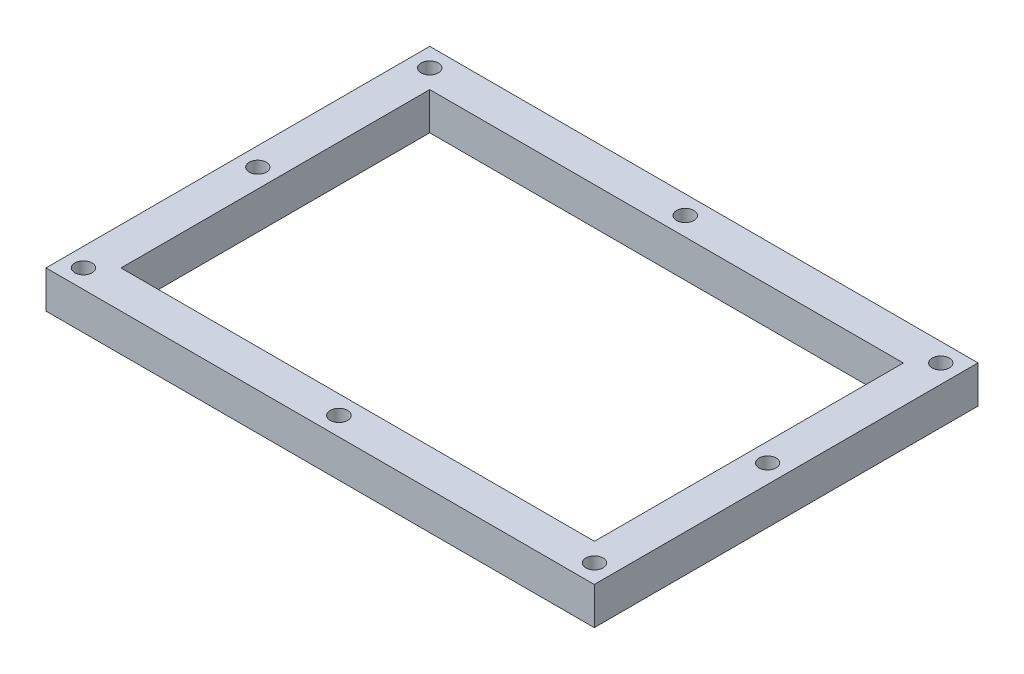
ISO-10303-21;
HEADER;
FILE_DESCRIPTION(('STEP AP214'),'2;1');
FILE_NAME('part.step','',(''),(''),'','','');
FILE_SCHEMA(('AUTOMOTIVE_DESIGN { 1 0 10303 214 1 1 1 1 }'));
ENDSEC;
DATA;
#1=APPLICATION_CONTEXT('core data for automotive mechanical design processes');
#2=APPLICATION_PROTOCOL_DEFINITION('international standard','automotive_design',2000,#1);
#3=PRODUCT_CONTEXT('',#1,'mechanical');
#4=PRODUCT('Part','Part','',(#3));
#5=PRODUCT_RELATED_PRODUCT_CATEGORY('part','',(#4));
#6=PRODUCT_DEFINITION_FORMATION('','',#4);
#7=PRODUCT_DEFINITION_CONTEXT('part definition',#1,'design');
#8=PRODUCT_DEFINITION('design','',#6,#7);
#9=PRODUCT_DEFINITION_SHAPE('','',#8);
#10=(LENGTH_UNIT() NAMED_UNIT(*) SI_UNIT(.MILLI.,.METRE.));
#11=(NAMED_UNIT(*) PLANE_ANGLE_UNIT() SI_UNIT($,.RADIAN.));
#12=(NAMED_UNIT(*) SI_UNIT($,.STERADIAN.) SOLID_ANGLE_UNIT());
#13=UNCERTAINTY_MEASURE_WITH_UNIT(LENGTH_MEASURE(1.E-05),#10,'distance_accuracy_value','');
#14=(GEOMETRIC_REPRESENTATION_CONTEXT(3) GLOBAL_UNCERTAINTY_ASSIGNED_CONTEXT((#13)) GLOBAL_UNIT_ASSIGNED_CONTEXT((#10,
#11,#12)) REPRESENTATION_CONTEXT('',''));
#15=CARTESIAN_POINT('',(0.,0.,0.));
#16=DIRECTION('',(0.,0.,1.));
#17=DIRECTION('',(1.,0.,0.));
#18=AXIS2_PLACEMENT_3D('',#15,#16,#17);
#19=CARTESIAN_POINT('',(-1.72565632312082E-12,246.195974268059,0.));
#20=DIRECTION('',(0.,1.,0.));
#21=DIRECTION('',(-1.,0.,0.));
#22=AXIS2_PLACEMENT_3D('',#19,#20,#21);
#23=PLANE('',#22);
#24=CARTESIAN_POINT('',(133.058980693896,246.19597426806,135.773129836377));
#25=DIRECTION('',(0.,1.,0.));
#26=DIRECTION('',(-1.,0.,0.));
#27=AXIS2_PLACEMENT_3D('',#24,#25,#26);
#28=CIRCLE('',#27,2.30000000000001);
#29=CARTESIAN_POINT('',(130.758980693896,246.19597426806,135.773129836377));
#30=VERTEX_POINT('',#29);
#31=EDGE_CURVE('E293',#30,#30,#28,.T.);
#32=ORIENTED_EDGE('',*,*,#31,.F.);
#33=EDGE_LOOP('',(#32));
#34=FACE_BOUND('',#33,.T.);
#35=CARTESIAN_POINT('',(-3.44101930610673,246.195974268059,43.2731298363772));
#36=DIRECTION('',(0.,1.,0.));
#37=DIRECTION('',(-1.,0.,0.));
#38=AXIS2_PLACEMENT_3D('',#35,#36,#37);
#39=CIRCLE('',#38,2.3);
#40=CARTESIAN_POINT('',(-5.74101930610673,246.195974268059,43.2731298363772));
#41=VERTEX_POINT('',#40);
#42=EDGE_CURVE('E127',#41,#41,#39,.T.);
#43=ORIENTED_EDGE('',*,*,#42,.F.);
#44=EDGE_LOOP('',(#43));
#45=FACE_BOUND('',#44,.T.);
#46=CARTESIAN_POINT('',(64.8089806938964,246.195974268059,135.773129836377));
#47=DIRECTION('',(0.,1.,0.));
#48=DIRECTION('',(-1.,0.,0.));
#49=AXIS2_PLACEMENT_3D('',#46,#47,#48);
#50=CIRCLE('',#49,2.32929018177819);
#51=CARTESIAN_POINT('',(62.4796905121182,246.195974268059,135.773129836377));
#52=VERTEX_POINT('',#51);
#53=EDGE_CURVE('E143',#52,#52,#50,.T.);
#54=ORIENTED_EDGE('',*,*,#53,.F.);
#55=EDGE_LOOP('',(#54));
#56=FACE_BOUND('',#55,.T.);
#57=CARTESIAN_POINT('',(64.8089806938931,246.195974268059,43.2731298363772));
#58=DIRECTION('',(0.,1.,0.));
#59=DIRECTION('',(-1.,0.,0.));
#60=AXIS2_PLACEMENT_3D('',#57,#58,#59);
#61=CIRCLE('',#60,2.32929018177819);
#62=CARTESIAN_POINT('',(62.4796905121149,246.195974268059,43.2731298363772));
#63=VERTEX_POINT('',#62);
#64=EDGE_CURVE('E155',#63,#63,#61,.T.);
#65=ORIENTED_EDGE('',*,*,#64,.F.);
#66=EDGE_LOOP('',(#65));
#67=FACE_BOUND('',#66,.T.);
#68=DIRECTION('',(1.,0.,0.));
#69=VECTOR('',#68,1.);
#70=CARTESIAN_POINT('',(138.010541363209,246.19597426806,140.773129836377));
#71=LINE('',#70,#69);
#72=CARTESIAN_POINT('',(-8.44101930610687,246.195974268059,140.773129836377));
#73=VERTEX_POINT('',#72);
#74=CARTESIAN_POINT('',(138.010541363209,246.19597426806,140.773129836377));
#75=VERTEX_POINT('',#74);
#76=EDGE_CURVE('E161',#73,#75,#71,.T.);
#77=ORIENTED_EDGE('',*,*,#76,.T.);
#78=DIRECTION('',(0.,0.,-1.));
#79=VECTOR('',#78,1.);
#80=CARTESIAN_POINT('',(138.010541363209,246.19597426806,140.773129836377));
#81=LINE('',#80,#79);
#82=CARTESIAN_POINT('',(138.010541363209,246.19597426806,38.2731298363773));
#83=VERTEX_POINT('',#82);
#84=EDGE_CURVE('E164',#75,#83,#81,.T.);
#85=ORIENTED_EDGE('',*,*,#84,.T.);
#86=DIRECTION('',(-1.,0.,0.));
#87=VECTOR('',#86,1.);
#88=CARTESIAN_POINT('',(138.010541363209,246.19597426806,38.2731298363773));
#89=LINE('',#88,#87);
#90=CARTESIAN_POINT('',(-8.44101930610687,246.195974268059,38.2731298363773));
#91=VERTEX_POINT('',#90);
#92=EDGE_CURVE('E167',#83,#91,#89,.T.);
#93=ORIENTED_EDGE('',*,*,#92,.T.);
#94=DIRECTION('',(0.,0.,1.));
#95=VECTOR('',#94,1.);
#96=CARTESIAN_POINT('',(-8.44101930610687,246.195974268059,38.2731298363773));
#97=LINE('',#96,#95);
#98=EDGE_CURVE('E169',#91,#73,#97,.T.);
#99=ORIENTED_EDGE('',*,*,#98,.T.);
#100=EDGE_LOOP('',(#77,#85,#93,#99));
#101=FACE_BOUND('',#100,.T.);
#102=CARTESIAN_POINT('',(-3.44101930610673,246.195974268059,89.1878173326564));
#103=DIRECTION('',(0.,1.,0.));
#104=DIRECTION('',(-1.,0.,0.));
#105=AXIS2_PLACEMENT_3D('',#102,#103,#104);
#106=CIRCLE('',#105,2.29999999999999);
#107=CARTESIAN_POINT('',(-5.74101930610672,246.195974268059,89.1878173326564));
#108=VERTEX_POINT('',#107);
#109=EDGE_CURVE('E149',#108,#108,#106,.T.);
#110=ORIENTED_EDGE('',*,*,#109,.F.);
#111=EDGE_LOOP('',(#110));
#112=FACE_BOUND('',#111,.T.);
#113=CARTESIAN_POINT('',(133.058980693896,246.19597426806,89.5231298363773));
#114=DIRECTION('',(0.,1.,0.));
#115=DIRECTION('',(-1.,0.,0.));
#116=AXIS2_PLACEMENT_3D('',#113,#114,#115);
#117=CIRCLE('',#116,2.30000000000001);
#118=CARTESIAN_POINT('',(130.758980693896,246.19597426806,89.5231298363773));
#119=VERTEX_POINT('',#118);
#120=EDGE_CURVE('E137',#119,#119,#117,.T.);
#121=ORIENTED_EDGE('',*,*,#120,.F.);
#122=EDGE_LOOP('',(#121));
#123=FACE_BOUND('',#122,.T.);
#124=DIRECTION('',(0.,0.,-1.));
#125=VECTOR('',#124,1.);
#126=CARTESIAN_POINT('',(128.058980693893,246.19597426806,48.2731298363773));
#127=LINE('',#126,#125);
#128=CARTESIAN_POINT('',(128.058980693893,246.19597426806,130.773129836377));
#129=VERTEX_POINT('',#128);
#130=CARTESIAN_POINT('',(128.058980693893,246.19597426806,48.2731298363773));
#131=VERTEX_POINT('',#130);
#132=EDGE_CURVE('E106',#129,#131,#127,.T.);
#133=ORIENTED_EDGE('',*,*,#132,.F.);
#134=DIRECTION('',(1.,0.,0.));
#135=VECTOR('',#134,1.);
#136=CARTESIAN_POINT('',(128.058980693893,246.19597426806,130.773129836377));
#137=LINE('',#136,#135);
#138=CARTESIAN_POINT('',(1.5919620459109,246.195974268059,130.773129836377));
#139=VERTEX_POINT('',#138);
#140=EDGE_CURVE('E98',#139,#129,#137,.T.);
#141=ORIENTED_EDGE('',*,*,#140,.F.);
#142=DIRECTION('',(0.000399773931906245,0.,0.999999920090399));
#143=VECTOR('',#142,1.);
#144=CARTESIAN_POINT('',(1.5919620459109,246.195974268059,130.773129836377));
#145=LINE('',#144,#143);
#146=CARTESIAN_POINT('',(1.55898069389311,246.195974268059,48.2731298363773));
#147=VERTEX_POINT('',#146);
#148=EDGE_CURVE('E121',#147,#139,#145,.T.);
#149=ORIENTED_EDGE('',*,*,#148,.F.);
#150=DIRECTION('',(-1.,0.,0.));
#151=VECTOR('',#150,1.);
#152=CARTESIAN_POINT('',(1.55898069389311,246.195974268059,48.2731298363773));
#153=LINE('',#152,#151);
#154=EDGE_CURVE('E119',#131,#147,#153,.T.);
#155=ORIENTED_EDGE('',*,*,#154,.F.);
#156=EDGE_LOOP('',(#133,#141,#149,#155));
#157=FACE_BOUND('',#156,.T.);
#158=CARTESIAN_POINT('',(133.058980693896,246.19597426806,43.2731298363772));
#159=DIRECTION('',(0.,1.,0.));
#160=DIRECTION('',(-1.,0.,0.));
#161=AXIS2_PLACEMENT_3D('',#158,#159,#160);
#162=CIRCLE('',#161,2.30000000000001);
#163=CARTESIAN_POINT('',(130.758980693896,246.19597426806,43.2731298363772));
#164=VERTEX_POINT('',#163);
#165=EDGE_CURVE('E299',#164,#164,#162,.T.);
#166=ORIENTED_EDGE('',*,*,#165,.F.);
#167=EDGE_LOOP('',(#166));
#168=FACE_BOUND('',#167,.T.);
#169=CARTESIAN_POINT('',(-3.44101930610673,246.195974268059,135.773129836377));
#170=DIRECTION('',(0.,1.,0.));
#171=DIRECTION('',(-1.,0.,0.));
#172=AXIS2_PLACEMENT_3D('',#169,#170,#171);
#173=CIRCLE('',#172,2.3);
#174=CARTESIAN_POINT('',(-5.74101930610673,246.195974268059,135.773129836377));
#175=VERTEX_POINT('',#174);
#176=EDGE_CURVE('E284',#175,#175,#173,.T.);
#177=ORIENTED_EDGE('',*,*,#176,.F.);
#178=EDGE_LOOP('',(#177));
#179=FACE_BOUND('',#178,.T.);
#180=ADVANCED_FACE('F33',(#34,#45,#56,#67,#101,#112,#123,#157,#168,#179),#23,.T.);
#181=CARTESIAN_POINT('',(-1.65626738408175E-12,236.195974268059,0.));
#182=DIRECTION('',(0.,1.,0.));
#183=DIRECTION('',(-1.,0.,0.));
#184=AXIS2_PLACEMENT_3D('',#181,#182,#183);
#185=PLANE('',#184);
#186=CARTESIAN_POINT('',(133.058980693896,236.19597426806,89.5231298363773));
#187=DIRECTION('',(0.,1.,0.));
#188=DIRECTION('',(-1.,0.,0.));
#189=AXIS2_PLACEMENT_3D('',#186,#187,#188);
#190=CIRCLE('',#189,2.30000000000001);
#191=CARTESIAN_POINT('',(130.758980693896,236.19597426806,89.5231298363773));
#192=VERTEX_POINT('',#191);
#193=EDGE_CURVE('E114',#192,#192,#190,.T.);
#194=ORIENTED_EDGE('',*,*,#193,.T.);
#195=EDGE_LOOP('',(#194));
#196=FACE_BOUND('',#195,.T.);
#197=CARTESIAN_POINT('',(64.8089806938964,236.195974268059,135.773129836377));
#198=DIRECTION('',(0.,1.,0.));
#199=DIRECTION('',(-1.,0.,0.));
#200=AXIS2_PLACEMENT_3D('',#197,#198,#199);
#201=CIRCLE('',#200,2.32929018177819);
#202=CARTESIAN_POINT('',(62.4796905121182,236.195974268059,135.773129836377));
#203=VERTEX_POINT('',#202);
#204=EDGE_CURVE('E140',#203,#203,#201,.T.);
#205=ORIENTED_EDGE('',*,*,#204,.T.);
#206=EDGE_LOOP('',(#205));
#207=FACE_BOUND('',#206,.T.);
#208=CARTESIAN_POINT('',(-3.44101930610666,236.195974268059,89.1878173326564));
#209=DIRECTION('',(0.,1.,0.));
#210=DIRECTION('',(-1.,0.,0.));
#211=AXIS2_PLACEMENT_3D('',#208,#209,#210);
#212=CIRCLE('',#211,2.29999999999999);
#213=CARTESIAN_POINT('',(-5.74101930610665,236.195974268059,89.1878173326564));
#214=VERTEX_POINT('',#213);
#215=EDGE_CURVE('E146',#214,#214,#212,.T.);
#216=ORIENTED_EDGE('',*,*,#215,.T.);
#217=EDGE_LOOP('',(#216));
#218=FACE_BOUND('',#217,.T.);
#219=CARTESIAN_POINT('',(64.8089806938932,236.195974268059,43.2731298363772));
#220=DIRECTION('',(0.,1.,0.));
#221=DIRECTION('',(-1.,0.,0.));
#222=AXIS2_PLACEMENT_3D('',#219,#220,#221);
#223=CIRCLE('',#222,2.32929018177819);
#224=CARTESIAN_POINT('',(62.479690512115,236.195974268059,43.2731298363772));
#225=VERTEX_POINT('',#224);
#226=EDGE_CURVE('E152',#225,#225,#223,.T.);
#227=ORIENTED_EDGE('',*,*,#226,.T.);
#228=EDGE_LOOP('',(#227));
#229=FACE_BOUND('',#228,.T.);
#230=DIRECTION('',(1.,0.,0.));
#231=VECTOR('',#230,1.);
#232=CARTESIAN_POINT('',(138.010541363209,236.19597426806,140.773129836377));
#233=LINE('',#232,#231);
#234=CARTESIAN_POINT('',(-8.4410193061068,236.195974268059,140.773129836377));
#235=VERTEX_POINT('',#234);
#236=CARTESIAN_POINT('',(138.010541363209,236.19597426806,140.773129836377));
#237=VERTEX_POINT('',#236);
#238=EDGE_CURVE('E158',#235,#237,#233,.T.);
#239=ORIENTED_EDGE('',*,*,#238,.F.);
#240=DIRECTION('',(0.,0.,1.));
#241=VECTOR('',#240,1.);
#242=CARTESIAN_POINT('',(-8.4410193061068,236.195974268059,38.2731298363773));
#243=LINE('',#242,#241);
#244=CARTESIAN_POINT('',(-8.4410193061068,236.195974268059,38.2731298363773));
#245=VERTEX_POINT('',#244);
#246=EDGE_CURVE('E165',#245,#235,#243,.T.);
#247=ORIENTED_EDGE('',*,*,#246,.F.);
#248=DIRECTION('',(-1.,0.,0.));
#249=VECTOR('',#248,1.);
#250=CARTESIAN_POINT('',(138.010541363209,236.19597426806,38.2731298363773));
#251=LINE('',#250,#249);
#252=CARTESIAN_POINT('',(138.010541363209,236.19597426806,38.2731298363773));
#253=VERTEX_POINT('',#252);
#254=EDGE_CURVE('E176',#253,#245,#251,.T.);
#255=ORIENTED_EDGE('',*,*,#254,.F.);
#256=DIRECTION('',(0.,0.,-1.));
#257=VECTOR('',#256,1.);
#258=CARTESIAN_POINT('',(138.010541363209,236.19597426806,140.773129836377));
#259=LINE('',#258,#257);
#260=EDGE_CURVE('E174',#237,#253,#259,.T.);
#261=ORIENTED_EDGE('',*,*,#260,.F.);
#262=EDGE_LOOP('',(#239,#247,#255,#261));
#263=FACE_BOUND('',#262,.T.);
#264=DIRECTION('',(1.,0.,0.));
#265=VECTOR('',#264,1.);
#266=CARTESIAN_POINT('',(128.058980693893,236.19597426806,130.773129836377));
#267=LINE('',#266,#265);
#268=CARTESIAN_POINT('',(1.59196204591097,236.195974268059,130.773129836377));
#269=VERTEX_POINT('',#268);
#270=CARTESIAN_POINT('',(128.058980693893,236.19597426806,130.773129836377));
#271=VERTEX_POINT('',#270);
#272=EDGE_CURVE('E56',#269,#271,#267,.T.);
#273=ORIENTED_EDGE('',*,*,#272,.T.);
#274=DIRECTION('',(0.,0.,-1.));
#275=VECTOR('',#274,1.);
#276=CARTESIAN_POINT('',(128.058980693893,236.19597426806,48.2731298363773));
#277=LINE('',#276,#275);
#278=CARTESIAN_POINT('',(128.058980693893,236.19597426806,48.2731298363773));
#279=VERTEX_POINT('',#278);
#280=EDGE_CURVE('E113',#271,#279,#277,.T.);
#281=ORIENTED_EDGE('',*,*,#280,.T.);
#282=DIRECTION('',(-1.,0.,0.));
#283=VECTOR('',#282,1.);
#284=CARTESIAN_POINT('',(1.55898069389318,236.195974268059,48.2731298363773));
#285=LINE('',#284,#283);
#286=CARTESIAN_POINT('',(1.55898069389318,236.195974268059,48.2731298363773));
#287=VERTEX_POINT('',#286);
#288=EDGE_CURVE('E129',#279,#287,#285,.T.);
#289=ORIENTED_EDGE('',*,*,#288,.T.);
#290=DIRECTION('',(0.000399773931906245,0.,0.999999920090399));
#291=VECTOR('',#290,1.);
#292=CARTESIAN_POINT('',(1.59196204591097,236.195974268059,130.773129836377));
#293=LINE('',#292,#291);
#294=EDGE_CURVE('E107',#287,#269,#293,.T.);
#295=ORIENTED_EDGE('',*,*,#294,.T.);
#296=EDGE_LOOP('',(#273,#281,#289,#295));
#297=FACE_BOUND('',#296,.T.);
#298=CARTESIAN_POINT('',(-3.44101930610666,236.195974268059,43.2731298363772));
#299=DIRECTION('',(0.,1.,0.));
#300=DIRECTION('',(-1.,0.,0.));
#301=AXIS2_PLACEMENT_3D('',#298,#299,#300);
#302=CIRCLE('',#301,2.3);
#303=CARTESIAN_POINT('',(-5.74101930610666,236.195974268059,43.2731298363772));
#304=VERTEX_POINT('',#303);
#305=EDGE_CURVE('E302',#304,#304,#302,.T.);
#306=ORIENTED_EDGE('',*,*,#305,.T.);
#307=EDGE_LOOP('',(#306));
#308=FACE_BOUND('',#307,.T.);
#309=CARTESIAN_POINT('',(133.058980693896,236.19597426806,43.2731298363772));
#310=DIRECTION('',(0.,1.,0.));
#311=DIRECTION('',(-1.,0.,0.));
#312=AXIS2_PLACEMENT_3D('',#309,#310,#311);
#313=CIRCLE('',#312,2.30000000000001);
#314=CARTESIAN_POINT('',(130.758980693896,236.19597426806,43.2731298363772));
#315=VERTEX_POINT('',#314);
#316=EDGE_CURVE('E296',#315,#315,#313,.T.);
#317=ORIENTED_EDGE('',*,*,#316,.T.);
#318=EDGE_LOOP('',(#317));
#319=FACE_BOUND('',#318,.T.);
#320=CARTESIAN_POINT('',(133.058980693896,236.19597426806,135.773129836377));
#321=DIRECTION('',(0.,1.,0.));
#322=DIRECTION('',(-1.,0.,0.));
#323=AXIS2_PLACEMENT_3D('',#320,#321,#322);
#324=CIRCLE('',#323,2.30000000000001);
#325=CARTESIAN_POINT('',(130.758980693896,236.19597426806,135.773129836377));
#326=VERTEX_POINT('',#325);
#327=EDGE_CURVE('E290',#326,#326,#324,.T.);
#328=ORIENTED_EDGE('',*,*,#327,.T.);
#329=EDGE_LOOP('',(#328));
#330=FACE_BOUND('',#329,.T.);
#331=CARTESIAN_POINT('',(-3.44101930610666,236.195974268059,135.773129836377));
#332=DIRECTION('',(0.,1.,0.));
#333=DIRECTION('',(-1.,0.,0.));
#334=AXIS2_PLACEMENT_3D('',#331,#332,#333);
#335=CIRCLE('',#334,2.3);
#336=CARTESIAN_POINT('',(-5.74101930610666,236.195974268059,135.773129836377));
#337=VERTEX_POINT('',#336);
#338=EDGE_CURVE('E287',#337,#337,#335,.T.);
#339=ORIENTED_EDGE('',*,*,#338,.T.);
#340=EDGE_LOOP('',(#339));
#341=FACE_BOUND('',#340,.T.);
#342=ADVANCED_FACE('F194',(#196,#207,#218,#229,#263,#297,#308,#319,#330,#341),#185,.F.);
#343=CARTESIAN_POINT('',(138.010541363209,246.19597426806,140.773129836377));
#344=DIRECTION('',(0.,0.,-1.));
#345=DIRECTION('',(-1.,0.,0.));
#346=AXIS2_PLACEMENT_3D('',#343,#344,#345);
#347=PLANE('',#346);
#348=ORIENTED_EDGE('',*,*,#238,.T.);
#349=DIRECTION('',(0.,-1.,0.));
#350=VECTOR('',#349,1.);
#351=CARTESIAN_POINT('',(138.010541363209,246.19597426806,140.773129836377));
#352=LINE('',#351,#350);
#353=EDGE_CURVE('E11',#75,#237,#352,.T.);
#354=ORIENTED_EDGE('',*,*,#353,.F.);
#355=ORIENTED_EDGE('',*,*,#76,.F.);
#356=DIRECTION('',(0.,-1.,0.));
#357=VECTOR('',#356,1.);
#358=CARTESIAN_POINT('',(-8.44101930610687,246.195974268059,140.773129836377));
#359=LINE('',#358,#357);
#360=EDGE_CURVE('E171',#73,#235,#359,.T.);
#361=ORIENTED_EDGE('',*,*,#360,.T.);
#362=EDGE_LOOP('',(#348,#354,#355,#361));
#363=FACE_BOUND('',#362,.T.);
#364=ADVANCED_FACE('F35',(#363),#347,.F.);
#365=CARTESIAN_POINT('',(138.010541363209,246.19597426806,140.773129836377));
#366=DIRECTION('',(-1.,0.,0.));
#367=DIRECTION('',(0.,-1.,0.));
#368=AXIS2_PLACEMENT_3D('',#365,#366,#367);
#369=PLANE('',#368);
#370=ORIENTED_EDGE('',*,*,#260,.T.);
#371=DIRECTION('',(0.,-1.,0.));
#372=VECTOR('',#371,1.);
#373=CARTESIAN_POINT('',(138.010541363209,246.19597426806,38.2731298363773));
#374=LINE('',#373,#372);
#375=EDGE_CURVE('E41',#83,#253,#374,.T.);
#376=ORIENTED_EDGE('',*,*,#375,.F.);
#377=ORIENTED_EDGE('',*,*,#84,.F.);
#378=ORIENTED_EDGE('',*,*,#353,.T.);
#379=EDGE_LOOP('',(#370,#376,#377,#378));
#380=FACE_BOUND('',#379,.T.);
#381=ADVANCED_FACE('F205',(#380),#369,.F.);
#382=CARTESIAN_POINT('',(138.010541363209,246.19597426806,38.2731298363773));
#383=DIRECTION('',(0.,0.,1.));
#384=DIRECTION('',(1.,0.,0.));
#385=AXIS2_PLACEMENT_3D('',#382,#383,#384);
#386=PLANE('',#385);
#387=ORIENTED_EDGE('',*,*,#254,.T.);
#388=DIRECTION('',(0.,-1.,0.));
#389=VECTOR('',#388,1.);
#390=CARTESIAN_POINT('',(-8.44101930610687,246.195974268059,38.2731298363773));
#391=LINE('',#390,#389);
#392=EDGE_CURVE('E181',#91,#245,#391,.T.);
#393=ORIENTED_EDGE('',*,*,#392,.F.);
#394=ORIENTED_EDGE('',*,*,#92,.F.);
#395=ORIENTED_EDGE('',*,*,#375,.T.);
#396=EDGE_LOOP('',(#387,#393,#394,#395));
#397=FACE_BOUND('',#396,.T.);
#398=ADVANCED_FACE('F188',(#397),#386,.F.);
#399=CARTESIAN_POINT('',(-8.44101930610687,246.195974268059,38.2731298363773));
#400=DIRECTION('',(1.,0.,0.));
#401=DIRECTION('',(0.,1.,0.));
#402=AXIS2_PLACEMENT_3D('',#399,#400,#401);
#403=PLANE('',#402);
#404=ORIENTED_EDGE('',*,*,#246,.T.);
#405=ORIENTED_EDGE('',*,*,#360,.F.);
#406=ORIENTED_EDGE('',*,*,#98,.F.);
#407=ORIENTED_EDGE('',*,*,#392,.T.);
#408=EDGE_LOOP('',(#404,#405,#406,#407));
#409=FACE_BOUND('',#408,.T.);
#410=ADVANCED_FACE('F198',(#409),#403,.F.);
#411=CARTESIAN_POINT('',(64.8089806938931,246.195974268059,43.2731298363772));
#412=DIRECTION('',(0.,-1.,0.));
#413=DIRECTION('',(1.,0.,0.));
#414=AXIS2_PLACEMENT_3D('',#411,#412,#413);
#415=CYLINDRICAL_SURFACE('',#414,2.32929018177819);
#416=ORIENTED_EDGE('',*,*,#64,.T.);
#417=EDGE_LOOP('',(#416));
#418=FACE_BOUND('',#417,.T.);
#419=ORIENTED_EDGE('',*,*,#226,.F.);
#420=EDGE_LOOP('',(#419));
#421=FACE_BOUND('',#420,.T.);
#422=ADVANCED_FACE('F223',(#418,#421),#415,.F.);
#423=CARTESIAN_POINT('',(-3.44101930610673,246.195974268059,89.1878173326564));
#424=DIRECTION('',(0.,-1.,0.));
#425=DIRECTION('',(1.,0.,0.));
#426=AXIS2_PLACEMENT_3D('',#423,#424,#425);
#427=CYLINDRICAL_SURFACE('',#426,2.29999999999999);
#428=ORIENTED_EDGE('',*,*,#109,.T.);
#429=EDGE_LOOP('',(#428));
#430=FACE_BOUND('',#429,.T.);
#431=ORIENTED_EDGE('',*,*,#215,.F.);
#432=EDGE_LOOP('',(#431));
#433=FACE_BOUND('',#432,.T.);
#434=ADVANCED_FACE('F230',(#430,#433),#427,.F.);
#435=CARTESIAN_POINT('',(64.8089806938964,246.195974268059,135.773129836377));
#436=DIRECTION('',(0.,-1.,0.));
#437=DIRECTION('',(1.,0.,0.));
#438=AXIS2_PLACEMENT_3D('',#435,#436,#437);
#439=CYLINDRICAL_SURFACE('',#438,2.32929018177819);
#440=ORIENTED_EDGE('',*,*,#53,.T.);
#441=EDGE_LOOP('',(#440));
#442=FACE_BOUND('',#441,.T.);
#443=ORIENTED_EDGE('',*,*,#204,.F.);
#444=EDGE_LOOP('',(#443));
#445=FACE_BOUND('',#444,.T.);
#446=ADVANCED_FACE('F235',(#442,#445),#439,.F.);
#447=CARTESIAN_POINT('',(133.058980693896,246.19597426806,89.5231298363773));
#448=DIRECTION('',(0.,-1.,0.));
#449=DIRECTION('',(1.,0.,0.));
#450=AXIS2_PLACEMENT_3D('',#447,#448,#449);
#451=CYLINDRICAL_SURFACE('',#450,2.30000000000001);
#452=ORIENTED_EDGE('',*,*,#120,.T.);
#453=EDGE_LOOP('',(#452));
#454=FACE_BOUND('',#453,.T.);
#455=ORIENTED_EDGE('',*,*,#193,.F.);
#456=EDGE_LOOP('',(#455));
#457=FACE_BOUND('',#456,.T.);
#458=ADVANCED_FACE('F245',(#454,#457),#451,.F.);
#459=CARTESIAN_POINT('',(128.058980693893,246.19597426806,130.773129836377));
#460=DIRECTION('',(0.,0.,-1.));
#461=DIRECTION('',(-1.,0.,0.));
#462=AXIS2_PLACEMENT_3D('',#459,#460,#461);
#463=PLANE('',#462);
#464=ORIENTED_EDGE('',*,*,#272,.F.);
#465=DIRECTION('',(0.,-1.,0.));
#466=VECTOR('',#465,1.);
#467=CARTESIAN_POINT('',(1.5919620459109,246.195974268059,130.773129836377));
#468=LINE('',#467,#466);
#469=EDGE_CURVE('E102',#139,#269,#468,.T.);
#470=ORIENTED_EDGE('',*,*,#469,.F.);
#471=ORIENTED_EDGE('',*,*,#140,.T.);
#472=DIRECTION('',(0.,-1.,0.));
#473=VECTOR('',#472,1.);
#474=CARTESIAN_POINT('',(128.058980693893,246.19597426806,130.773129836377));
#475=LINE('',#474,#473);
#476=EDGE_CURVE('E101',#129,#271,#475,.T.);
#477=ORIENTED_EDGE('',*,*,#476,.T.);
#478=EDGE_LOOP('',(#464,#470,#471,#477));
#479=FACE_BOUND('',#478,.T.);
#480=ADVANCED_FACE('F100',(#479),#463,.T.);
#481=CARTESIAN_POINT('',(128.058980693893,246.19597426806,48.2731298363773));
#482=DIRECTION('',(-1.,0.,0.));
#483=DIRECTION('',(0.,-1.,0.));
#484=AXIS2_PLACEMENT_3D('',#481,#482,#483);
#485=PLANE('',#484);
#486=ORIENTED_EDGE('',*,*,#280,.F.);
#487=ORIENTED_EDGE('',*,*,#476,.F.);
#488=ORIENTED_EDGE('',*,*,#132,.T.);
#489=DIRECTION('',(0.,-1.,0.));
#490=VECTOR('',#489,1.);
#491=CARTESIAN_POINT('',(128.058980693893,246.19597426806,48.2731298363773));
#492=LINE('',#491,#490);
#493=EDGE_CURVE('E115',#131,#279,#492,.T.);
#494=ORIENTED_EDGE('',*,*,#493,.T.);
#495=EDGE_LOOP('',(#486,#487,#488,#494));
#496=FACE_BOUND('',#495,.T.);
#497=ADVANCED_FACE('F110',(#496),#485,.T.);
#498=CARTESIAN_POINT('',(1.55898069389311,246.195974268059,48.2731298363773));
#499=DIRECTION('',(0.,0.,1.));
#500=DIRECTION('',(1.,0.,0.));
#501=AXIS2_PLACEMENT_3D('',#498,#499,#500);
#502=PLANE('',#501);
#503=ORIENTED_EDGE('',*,*,#288,.F.);
#504=ORIENTED_EDGE('',*,*,#493,.F.);
#505=ORIENTED_EDGE('',*,*,#154,.T.);
#506=DIRECTION('',(0.,-1.,0.));
#507=VECTOR('',#506,1.);
#508=CARTESIAN_POINT('',(1.55898069389311,246.195974268059,48.2731298363773));
#509=LINE('',#508,#507);
#510=EDGE_CURVE('E48',#147,#287,#509,.T.);
#511=ORIENTED_EDGE('',*,*,#510,.T.);
#512=EDGE_LOOP('',(#503,#504,#505,#511));
#513=FACE_BOUND('',#512,.T.);
#514=ADVANCED_FACE('F257',(#513),#502,.T.);
#515=CARTESIAN_POINT('',(1.5919620459109,246.195974268059,130.773129836377));
#516=DIRECTION('',(0.999999920090399,0.,-0.000399773931906245));
#517=DIRECTION('',(-0.000399773931906245,0.,-0.999999920090399));
#518=AXIS2_PLACEMENT_3D('',#515,#516,#517);
#519=PLANE('',#518);
#520=ORIENTED_EDGE('',*,*,#294,.F.);
#521=ORIENTED_EDGE('',*,*,#510,.F.);
#522=ORIENTED_EDGE('',*,*,#148,.T.);
#523=ORIENTED_EDGE('',*,*,#469,.T.);
#524=EDGE_LOOP('',(#520,#521,#522,#523));
#525=FACE_BOUND('',#524,.T.);
#526=ADVANCED_FACE('F260',(#525),#519,.T.);
#527=CARTESIAN_POINT('',(-3.44101930610673,246.195974268059,43.2731298363772));
#528=DIRECTION('',(0.,-1.,0.));
#529=DIRECTION('',(1.,0.,0.));
#530=AXIS2_PLACEMENT_3D('',#527,#528,#529);
#531=CYLINDRICAL_SURFACE('',#530,2.3);
#532=ORIENTED_EDGE('',*,*,#42,.T.);
#533=EDGE_LOOP('',(#532));
#534=FACE_BOUND('',#533,.T.);
#535=ORIENTED_EDGE('',*,*,#305,.F.);
#536=EDGE_LOOP('',(#535));
#537=FACE_BOUND('',#536,.T.);
#538=ADVANCED_FACE('F264',(#534,#537),#531,.F.);
#539=CARTESIAN_POINT('',(133.058980693896,246.19597426806,43.2731298363772));
#540=DIRECTION('',(0.,-1.,0.));
#541=DIRECTION('',(1.,0.,0.));
#542=AXIS2_PLACEMENT_3D('',#539,#540,#541);
#543=CYLINDRICAL_SURFACE('',#542,2.30000000000001);
#544=ORIENTED_EDGE('',*,*,#165,.T.);
#545=EDGE_LOOP('',(#544));
#546=FACE_BOUND('',#545,.T.);
#547=ORIENTED_EDGE('',*,*,#316,.F.);
#548=EDGE_LOOP('',(#547));
#549=FACE_BOUND('',#548,.T.);
#550=ADVANCED_FACE('F267',(#546,#549),#543,.F.);
#551=CARTESIAN_POINT('',(133.058980693896,246.19597426806,135.773129836377));
#552=DIRECTION('',(0.,-1.,0.));
#553=DIRECTION('',(1.,0.,0.));
#554=AXIS2_PLACEMENT_3D('',#551,#552,#553);
#555=CYLINDRICAL_SURFACE('',#554,2.30000000000001);
#556=ORIENTED_EDGE('',*,*,#31,.T.);
#557=EDGE_LOOP('',(#556));
#558=FACE_BOUND('',#557,.T.);
#559=ORIENTED_EDGE('',*,*,#327,.F.);
#560=EDGE_LOOP('',(#559));
#561=FACE_BOUND('',#560,.T.);
#562=ADVANCED_FACE('F271',(#558,#561),#555,.F.);
#563=CARTESIAN_POINT('',(-3.44101930610673,246.195974268059,135.773129836377));
#564=DIRECTION('',(0.,-1.,0.));
#565=DIRECTION('',(1.,0.,0.));
#566=AXIS2_PLACEMENT_3D('',#563,#564,#565);
#567=CYLINDRICAL_SURFACE('',#566,2.3);
#568=ORIENTED_EDGE('',*,*,#176,.T.);
#569=EDGE_LOOP('',(#568));
#570=FACE_BOUND('',#569,.T.);
#571=ORIENTED_EDGE('',*,*,#338,.F.);
#572=EDGE_LOOP('',(#571));
#573=FACE_BOUND('',#572,.T.);
#574=ADVANCED_FACE('F275',(#570,#573),#567,.F.);
#575=CLOSED_SHELL('',(#180,#342,#364,#381,#398,#410,#422,#434,#446,#458,#480,#497,#514,#526,
#538,#550,#562,#574));
#576=MANIFOLD_SOLID_BREP('B2',#575);
#577=ADVANCED_BREP_SHAPE_REPRESENTATION('',(#18,#576),#14);
#578=SHAPE_DEFINITION_REPRESENTATION(#9,#577);
ENDSEC;
END-ISO-10303-21;
